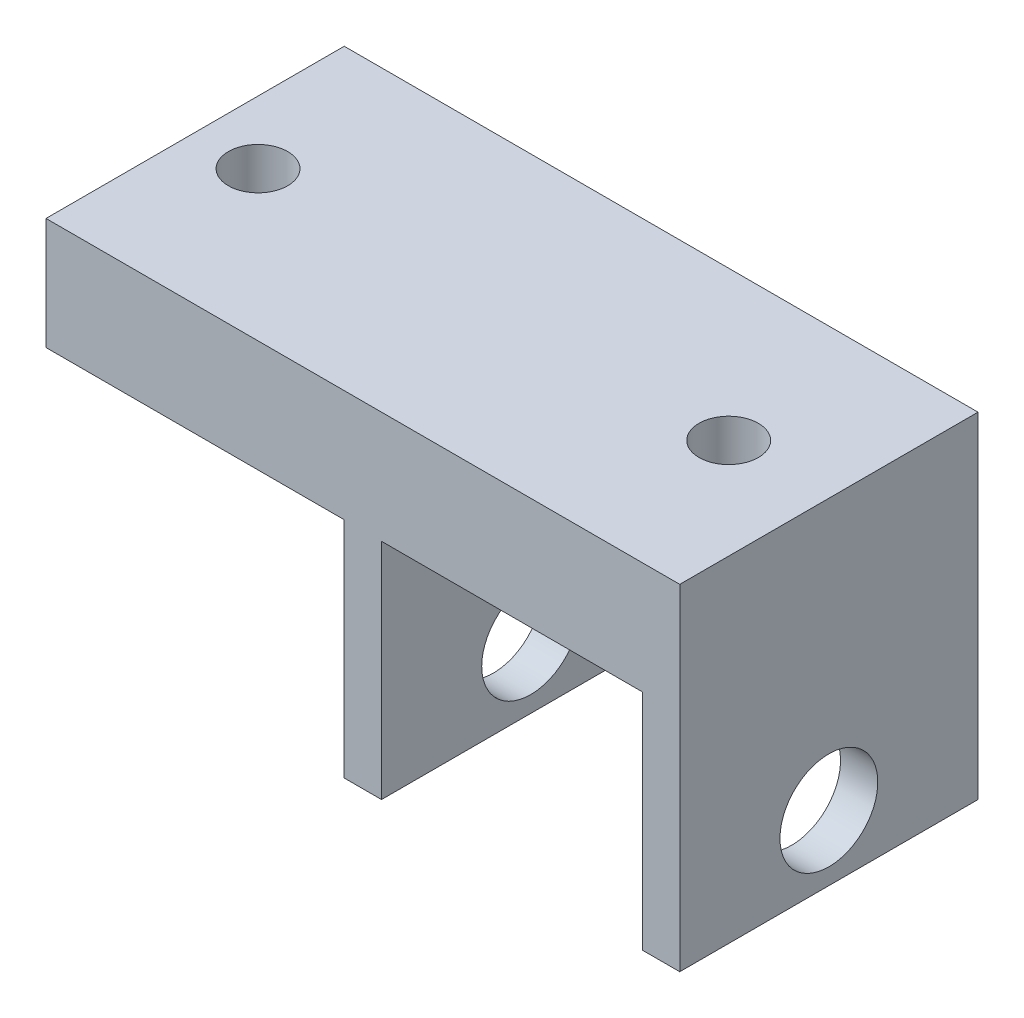
ISO-10303-21;
HEADER;
FILE_DESCRIPTION(('STEP AP214'),'2;1');
FILE_NAME('part.step','',(''),(''),'','','');
FILE_SCHEMA(('AUTOMOTIVE_DESIGN { 1 0 10303 214 1 1 1 1 }'));
ENDSEC;
DATA;
#1=APPLICATION_CONTEXT('core data for automotive mechanical design processes');
#2=APPLICATION_PROTOCOL_DEFINITION('international standard','automotive_design',2000,#1);
#3=PRODUCT_CONTEXT('',#1,'mechanical');
#4=PRODUCT('Part','Part','',(#3));
#5=PRODUCT_RELATED_PRODUCT_CATEGORY('part','',(#4));
#6=PRODUCT_DEFINITION_FORMATION('','',#4);
#7=PRODUCT_DEFINITION_CONTEXT('part definition',#1,'design');
#8=PRODUCT_DEFINITION('design','',#6,#7);
#9=PRODUCT_DEFINITION_SHAPE('','',#8);
#10=(LENGTH_UNIT() NAMED_UNIT(*) SI_UNIT(.MILLI.,.METRE.));
#11=(NAMED_UNIT(*) PLANE_ANGLE_UNIT() SI_UNIT($,.RADIAN.));
#12=(NAMED_UNIT(*) SI_UNIT($,.STERADIAN.) SOLID_ANGLE_UNIT());
#13=UNCERTAINTY_MEASURE_WITH_UNIT(LENGTH_MEASURE(1.E-05),#10,'distance_accuracy_value','');
#14=(GEOMETRIC_REPRESENTATION_CONTEXT(3) GLOBAL_UNCERTAINTY_ASSIGNED_CONTEXT((#13)) GLOBAL_UNIT_ASSIGNED_CONTEXT((#10,
#11,#12)) REPRESENTATION_CONTEXT('',''));
#15=CARTESIAN_POINT('',(0.,0.,0.));
#16=DIRECTION('',(0.,0.,1.));
#17=DIRECTION('',(1.,0.,0.));
#18=AXIS2_PLACEMENT_3D('',#15,#16,#17);
#19=CARTESIAN_POINT('',(-39.6875,19.05,25.4));
#20=DIRECTION('',(1.,0.,0.));
#21=DIRECTION('',(0.,0.,-1.));
#22=AXIS2_PLACEMENT_3D('',#19,#20,#21);
#23=PLANE('',#22);
#24=DIRECTION('',(0.,-1.,0.));
#25=VECTOR('',#24,1.);
#26=CARTESIAN_POINT('',(-39.6875,19.05,0.));
#27=LINE('',#26,#25);
#28=CARTESIAN_POINT('',(-39.6875,19.05,0.));
#29=VERTEX_POINT('',#28);
#30=CARTESIAN_POINT('',(-39.6875,9.525,0.));
#31=VERTEX_POINT('',#30);
#32=EDGE_CURVE('E142',#29,#31,#27,.T.);
#33=ORIENTED_EDGE('',*,*,#32,.T.);
#34=DIRECTION('',(0.,0.,-1.));
#35=VECTOR('',#34,1.);
#36=CARTESIAN_POINT('',(-39.6875,9.525,25.4));
#37=LINE('',#36,#35);
#38=CARTESIAN_POINT('',(-39.6875,9.525,25.4));
#39=VERTEX_POINT('',#38);
#40=EDGE_CURVE('E11',#39,#31,#37,.T.);
#41=ORIENTED_EDGE('',*,*,#40,.F.);
#42=DIRECTION('',(0.,-1.,0.));
#43=VECTOR('',#42,1.);
#44=CARTESIAN_POINT('',(-39.6875,19.05,25.4));
#45=LINE('',#44,#43);
#46=CARTESIAN_POINT('',(-39.6875,19.05,25.4));
#47=VERTEX_POINT('',#46);
#48=EDGE_CURVE('E166',#47,#39,#45,.T.);
#49=ORIENTED_EDGE('',*,*,#48,.F.);
#50=DIRECTION('',(0.,0.,-1.));
#51=VECTOR('',#50,1.);
#52=CARTESIAN_POINT('',(-39.6875,19.05,25.4));
#53=LINE('',#52,#51);
#54=EDGE_CURVE('E49',#47,#29,#53,.T.);
#55=ORIENTED_EDGE('',*,*,#54,.T.);
#56=EDGE_LOOP('',(#33,#41,#49,#55));
#57=FACE_BOUND('',#56,.T.);
#58=ADVANCED_FACE('F32',(#57),#23,.F.);
#59=CARTESIAN_POINT('',(-39.6875,9.525,25.4));
#60=DIRECTION('',(0.,1.,0.));
#61=DIRECTION('',(0.,0.,1.));
#62=AXIS2_PLACEMENT_3D('',#59,#60,#61);
#63=PLANE('',#62);
#64=CARTESIAN_POINT('',(-34.3296875,9.525,12.7));
#65=DIRECTION('',(0.,1.,0.));
#66=DIRECTION('',(0.,0.,1.));
#67=AXIS2_PLACEMENT_3D('',#64,#65,#66);
#68=CIRCLE('',#67,2.52729999999999);
#69=CARTESIAN_POINT('',(-34.3296875,9.525,15.2273));
#70=VERTEX_POINT('',#69);
#71=EDGE_CURVE('E249',#70,#70,#68,.T.);
#72=ORIENTED_EDGE('',*,*,#71,.T.);
#73=EDGE_LOOP('',(#72));
#74=FACE_BOUND('',#73,.T.);
#75=DIRECTION('',(1.,0.,0.));
#76=VECTOR('',#75,1.);
#77=CARTESIAN_POINT('',(-39.6875,9.525,0.));
#78=LINE('',#77,#76);
#79=CARTESIAN_POINT('',(-14.2875,9.525,0.));
#80=VERTEX_POINT('',#79);
#81=EDGE_CURVE('E144',#31,#80,#78,.T.);
#82=ORIENTED_EDGE('',*,*,#81,.T.);
#83=DIRECTION('',(0.,0.,-1.));
#84=VECTOR('',#83,1.);
#85=CARTESIAN_POINT('',(-14.2875,9.525,25.4));
#86=LINE('',#85,#84);
#87=CARTESIAN_POINT('',(-14.2875,9.525,25.4));
#88=VERTEX_POINT('',#87);
#89=EDGE_CURVE('E41',#88,#80,#86,.T.);
#90=ORIENTED_EDGE('',*,*,#89,.F.);
#91=DIRECTION('',(1.,0.,0.));
#92=VECTOR('',#91,1.);
#93=CARTESIAN_POINT('',(-39.6875,9.525,25.4));
#94=LINE('',#93,#92);
#95=EDGE_CURVE('E93',#39,#88,#94,.T.);
#96=ORIENTED_EDGE('',*,*,#95,.F.);
#97=ORIENTED_EDGE('',*,*,#40,.T.);
#98=EDGE_LOOP('',(#82,#90,#96,#97));
#99=FACE_BOUND('',#98,.T.);
#100=ADVANCED_FACE('F226',(#74,#99),#63,.F.);
#101=CARTESIAN_POINT('',(-14.2875,9.525,25.4));
#102=DIRECTION('',(1.,0.,0.));
#103=DIRECTION('',(0.,0.,-1.));
#104=AXIS2_PLACEMENT_3D('',#101,#102,#103);
#105=PLANE('',#104);
#106=CARTESIAN_POINT('',(-14.2875,-3.96875,12.7));
#107=DIRECTION('',(-1.,0.,0.));
#108=DIRECTION('',(0.,0.,1.));
#109=AXIS2_PLACEMENT_3D('',#106,#107,#108);
#110=CIRCLE('',#109,4.1671875);
#111=CARTESIAN_POINT('',(-14.2875,-3.96875,16.8671875));
#112=VERTEX_POINT('',#111);
#113=EDGE_CURVE('E241',#112,#112,#110,.T.);
#114=ORIENTED_EDGE('',*,*,#113,.F.);
#115=EDGE_LOOP('',(#114));
#116=FACE_BOUND('',#115,.T.);
#117=DIRECTION('',(0.,-1.,0.));
#118=VECTOR('',#117,1.);
#119=CARTESIAN_POINT('',(-14.2875,9.525,0.));
#120=LINE('',#119,#118);
#121=CARTESIAN_POINT('',(-14.2875,-9.525,0.));
#122=VERTEX_POINT('',#121);
#123=EDGE_CURVE('E147',#80,#122,#120,.T.);
#124=ORIENTED_EDGE('',*,*,#123,.T.);
#125=DIRECTION('',(0.,0.,-1.));
#126=VECTOR('',#125,1.);
#127=CARTESIAN_POINT('',(-14.2875,-9.525,25.4));
#128=LINE('',#127,#126);
#129=CARTESIAN_POINT('',(-14.2875,-9.525,25.4));
#130=VERTEX_POINT('',#129);
#131=EDGE_CURVE('E177',#130,#122,#128,.T.);
#132=ORIENTED_EDGE('',*,*,#131,.F.);
#133=DIRECTION('',(0.,-1.,0.));
#134=VECTOR('',#133,1.);
#135=CARTESIAN_POINT('',(-14.2875,9.525,25.4));
#136=LINE('',#135,#134);
#137=EDGE_CURVE('E186',#88,#130,#136,.T.);
#138=ORIENTED_EDGE('',*,*,#137,.F.);
#139=ORIENTED_EDGE('',*,*,#89,.T.);
#140=EDGE_LOOP('',(#124,#132,#138,#139));
#141=FACE_BOUND('',#140,.T.);
#142=ADVANCED_FACE('F184',(#116,#141),#105,.F.);
#143=CARTESIAN_POINT('',(-14.2875,-9.525,25.4));
#144=DIRECTION('',(0.,1.,0.));
#145=DIRECTION('',(0.,0.,1.));
#146=AXIS2_PLACEMENT_3D('',#143,#144,#145);
#147=PLANE('',#146);
#148=DIRECTION('',(1.,0.,0.));
#149=VECTOR('',#148,1.);
#150=CARTESIAN_POINT('',(-14.2875,-9.525,0.));
#151=LINE('',#150,#149);
#152=CARTESIAN_POINT('',(-11.1125,-9.525,0.));
#153=VERTEX_POINT('',#152);
#154=EDGE_CURVE('E149',#122,#153,#151,.T.);
#155=ORIENTED_EDGE('',*,*,#154,.T.);
#156=DIRECTION('',(0.,0.,-1.));
#157=VECTOR('',#156,1.);
#158=CARTESIAN_POINT('',(-11.1125,-9.525,25.4));
#159=LINE('',#158,#157);
#160=CARTESIAN_POINT('',(-11.1125,-9.525,25.4));
#161=VERTEX_POINT('',#160);
#162=EDGE_CURVE('E174',#161,#153,#159,.T.);
#163=ORIENTED_EDGE('',*,*,#162,.F.);
#164=DIRECTION('',(1.,0.,0.));
#165=VECTOR('',#164,1.);
#166=CARTESIAN_POINT('',(-14.2875,-9.525,25.4));
#167=LINE('',#166,#165);
#168=EDGE_CURVE('E202',#130,#161,#167,.T.);
#169=ORIENTED_EDGE('',*,*,#168,.F.);
#170=ORIENTED_EDGE('',*,*,#131,.T.);
#171=EDGE_LOOP('',(#155,#163,#169,#170));
#172=FACE_BOUND('',#171,.T.);
#173=ADVANCED_FACE('F193',(#172),#147,.F.);
#174=CARTESIAN_POINT('',(-11.1125,-9.525,25.4));
#175=DIRECTION('',(-1.,0.,0.));
#176=DIRECTION('',(0.,0.,1.));
#177=AXIS2_PLACEMENT_3D('',#174,#175,#176);
#178=PLANE('',#177);
#179=CARTESIAN_POINT('',(-11.1125,-3.96875,12.7));
#180=DIRECTION('',(-1.,0.,0.));
#181=DIRECTION('',(0.,0.,1.));
#182=AXIS2_PLACEMENT_3D('',#179,#180,#181);
#183=CIRCLE('',#182,4.1671875);
#184=CARTESIAN_POINT('',(-11.1125,-3.96875,16.8671875));
#185=VERTEX_POINT('',#184);
#186=EDGE_CURVE('E145',#185,#185,#183,.T.);
#187=ORIENTED_EDGE('',*,*,#186,.T.);
#188=EDGE_LOOP('',(#187));
#189=FACE_BOUND('',#188,.T.);
#190=DIRECTION('',(0.,1.,0.));
#191=VECTOR('',#190,1.);
#192=CARTESIAN_POINT('',(-11.1125,-9.525,0.));
#193=LINE('',#192,#191);
#194=CARTESIAN_POINT('',(-11.1125,9.525,0.));
#195=VERTEX_POINT('',#194);
#196=EDGE_CURVE('E151',#153,#195,#193,.T.);
#197=ORIENTED_EDGE('',*,*,#196,.T.);
#198=DIRECTION('',(0.,0.,-1.));
#199=VECTOR('',#198,1.);
#200=CARTESIAN_POINT('',(-11.1125,9.525,25.4));
#201=LINE('',#200,#199);
#202=CARTESIAN_POINT('',(-11.1125,9.525,25.4));
#203=VERTEX_POINT('',#202);
#204=EDGE_CURVE('E172',#203,#195,#201,.T.);
#205=ORIENTED_EDGE('',*,*,#204,.F.);
#206=DIRECTION('',(0.,1.,0.));
#207=VECTOR('',#206,1.);
#208=CARTESIAN_POINT('',(-11.1125,-9.525,25.4));
#209=LINE('',#208,#207);
#210=EDGE_CURVE('E199',#161,#203,#209,.T.);
#211=ORIENTED_EDGE('',*,*,#210,.F.);
#212=ORIENTED_EDGE('',*,*,#162,.T.);
#213=EDGE_LOOP('',(#197,#205,#211,#212));
#214=FACE_BOUND('',#213,.T.);
#215=ADVANCED_FACE('F197',(#189,#214),#178,.F.);
#216=CARTESIAN_POINT('',(11.1125,9.525,25.4));
#217=DIRECTION('',(0.,-1.,0.));
#218=DIRECTION('',(0.,0.,-1.));
#219=AXIS2_PLACEMENT_3D('',#216,#217,#218);
#220=PLANE('',#219);
#221=CARTESIAN_POINT('',(5.7546875,9.525,12.7));
#222=DIRECTION('',(0.,-1.,0.));
#223=DIRECTION('',(0.,0.,-1.));
#224=AXIS2_PLACEMENT_3D('',#221,#222,#223);
#225=CIRCLE('',#224,2.52729999999999);
#226=CARTESIAN_POINT('',(5.7546875,9.525,10.1727));
#227=VERTEX_POINT('',#226);
#228=EDGE_CURVE('E35',#227,#227,#225,.T.);
#229=ORIENTED_EDGE('',*,*,#228,.F.);
#230=EDGE_LOOP('',(#229));
#231=FACE_BOUND('',#230,.T.);
#232=DIRECTION('',(-1.,0.,0.));
#233=VECTOR('',#232,1.);
#234=CARTESIAN_POINT('',(11.1125,9.525,0.));
#235=LINE('',#234,#233);
#236=CARTESIAN_POINT('',(11.1125,9.525,0.));
#237=VERTEX_POINT('',#236);
#238=EDGE_CURVE('E154',#237,#195,#235,.T.);
#239=ORIENTED_EDGE('',*,*,#238,.F.);
#240=DIRECTION('',(0.,0.,-1.));
#241=VECTOR('',#240,1.);
#242=CARTESIAN_POINT('',(11.1125,9.525,25.4));
#243=LINE('',#242,#241);
#244=CARTESIAN_POINT('',(11.1125,9.525,25.4));
#245=VERTEX_POINT('',#244);
#246=EDGE_CURVE('E170',#245,#237,#243,.T.);
#247=ORIENTED_EDGE('',*,*,#246,.F.);
#248=DIRECTION('',(-1.,0.,0.));
#249=VECTOR('',#248,1.);
#250=CARTESIAN_POINT('',(11.1125,9.525,25.4));
#251=LINE('',#250,#249);
#252=EDGE_CURVE('E201',#245,#203,#251,.T.);
#253=ORIENTED_EDGE('',*,*,#252,.T.);
#254=ORIENTED_EDGE('',*,*,#204,.T.);
#255=EDGE_LOOP('',(#239,#247,#253,#254));
#256=FACE_BOUND('',#255,.T.);
#257=ADVANCED_FACE('F308',(#231,#256),#220,.T.);
#258=CARTESIAN_POINT('',(11.1125,-9.525,25.4));
#259=DIRECTION('',(-1.,0.,0.));
#260=DIRECTION('',(0.,0.,1.));
#261=AXIS2_PLACEMENT_3D('',#258,#259,#260);
#262=PLANE('',#261);
#263=CARTESIAN_POINT('',(11.1125,-3.96875,12.7));
#264=DIRECTION('',(-1.,0.,0.));
#265=DIRECTION('',(0.,0.,1.));
#266=AXIS2_PLACEMENT_3D('',#263,#264,#265);
#267=CIRCLE('',#266,4.1671875);
#268=CARTESIAN_POINT('',(11.1125,-3.96875,16.8671875));
#269=VERTEX_POINT('',#268);
#270=EDGE_CURVE('E237',#269,#269,#267,.T.);
#271=ORIENTED_EDGE('',*,*,#270,.F.);
#272=EDGE_LOOP('',(#271));
#273=FACE_BOUND('',#272,.T.);
#274=DIRECTION('',(0.,1.,0.));
#275=VECTOR('',#274,1.);
#276=CARTESIAN_POINT('',(11.1125,-9.525,0.));
#277=LINE('',#276,#275);
#278=CARTESIAN_POINT('',(11.1125,-9.525,0.));
#279=VERTEX_POINT('',#278);
#280=EDGE_CURVE('E157',#279,#237,#277,.T.);
#281=ORIENTED_EDGE('',*,*,#280,.F.);
#282=DIRECTION('',(0.,0.,-1.));
#283=VECTOR('',#282,1.);
#284=CARTESIAN_POINT('',(11.1125,-9.525,25.4));
#285=LINE('',#284,#283);
#286=CARTESIAN_POINT('',(11.1125,-9.525,25.4));
#287=VERTEX_POINT('',#286);
#288=EDGE_CURVE('E134',#287,#279,#285,.T.);
#289=ORIENTED_EDGE('',*,*,#288,.F.);
#290=DIRECTION('',(0.,1.,0.));
#291=VECTOR('',#290,1.);
#292=CARTESIAN_POINT('',(11.1125,-9.525,25.4));
#293=LINE('',#292,#291);
#294=EDGE_CURVE('E124',#287,#245,#293,.T.);
#295=ORIENTED_EDGE('',*,*,#294,.T.);
#296=ORIENTED_EDGE('',*,*,#246,.T.);
#297=EDGE_LOOP('',(#281,#289,#295,#296));
#298=FACE_BOUND('',#297,.T.);
#299=ADVANCED_FACE('F209',(#273,#298),#262,.T.);
#300=CARTESIAN_POINT('',(11.1125,-9.525,25.4));
#301=DIRECTION('',(0.,1.,0.));
#302=DIRECTION('',(0.,0.,1.));
#303=AXIS2_PLACEMENT_3D('',#300,#301,#302);
#304=PLANE('',#303);
#305=DIRECTION('',(1.,0.,0.));
#306=VECTOR('',#305,1.);
#307=CARTESIAN_POINT('',(11.1125,-9.525,0.));
#308=LINE('',#307,#306);
#309=CARTESIAN_POINT('',(14.2875,-9.525,0.));
#310=VERTEX_POINT('',#309);
#311=EDGE_CURVE('E131',#279,#310,#308,.T.);
#312=ORIENTED_EDGE('',*,*,#311,.T.);
#313=DIRECTION('',(0.,0.,-1.));
#314=VECTOR('',#313,1.);
#315=CARTESIAN_POINT('',(14.2875,-9.525,25.4));
#316=LINE('',#315,#314);
#317=CARTESIAN_POINT('',(14.2875,-9.525,25.4));
#318=VERTEX_POINT('',#317);
#319=EDGE_CURVE('E128',#318,#310,#316,.T.);
#320=ORIENTED_EDGE('',*,*,#319,.F.);
#321=DIRECTION('',(1.,0.,0.));
#322=VECTOR('',#321,1.);
#323=CARTESIAN_POINT('',(11.1125,-9.525,25.4));
#324=LINE('',#323,#322);
#325=EDGE_CURVE('E116',#287,#318,#324,.T.);
#326=ORIENTED_EDGE('',*,*,#325,.F.);
#327=ORIENTED_EDGE('',*,*,#288,.T.);
#328=EDGE_LOOP('',(#312,#320,#326,#327));
#329=FACE_BOUND('',#328,.T.);
#330=ADVANCED_FACE('F129',(#329),#304,.F.);
#331=CARTESIAN_POINT('',(14.2875,19.05,25.4));
#332=DIRECTION('',(1.,0.,0.));
#333=DIRECTION('',(0.,0.,-1.));
#334=AXIS2_PLACEMENT_3D('',#331,#332,#333);
#335=PLANE('',#334);
#336=CARTESIAN_POINT('',(14.2875,-3.96875,12.7));
#337=DIRECTION('',(-1.,0.,0.));
#338=DIRECTION('',(0.,0.,1.));
#339=AXIS2_PLACEMENT_3D('',#336,#337,#338);
#340=CIRCLE('',#339,4.1671875);
#341=CARTESIAN_POINT('',(14.2875,-3.96875,16.8671875));
#342=VERTEX_POINT('',#341);
#343=EDGE_CURVE('E240',#342,#342,#340,.T.);
#344=ORIENTED_EDGE('',*,*,#343,.T.);
#345=EDGE_LOOP('',(#344));
#346=FACE_BOUND('',#345,.T.);
#347=DIRECTION('',(0.,-1.,0.));
#348=VECTOR('',#347,1.);
#349=CARTESIAN_POINT('',(14.2875,19.05,0.));
#350=LINE('',#349,#348);
#351=CARTESIAN_POINT('',(14.2875,19.05,0.));
#352=VERTEX_POINT('',#351);
#353=EDGE_CURVE('E161',#352,#310,#350,.T.);
#354=ORIENTED_EDGE('',*,*,#353,.F.);
#355=DIRECTION('',(0.,0.,-1.));
#356=VECTOR('',#355,1.);
#357=CARTESIAN_POINT('',(14.2875,19.05,25.4));
#358=LINE('',#357,#356);
#359=CARTESIAN_POINT('',(14.2875,19.05,25.4));
#360=VERTEX_POINT('',#359);
#361=EDGE_CURVE('E81',#360,#352,#358,.T.);
#362=ORIENTED_EDGE('',*,*,#361,.F.);
#363=DIRECTION('',(0.,-1.,0.));
#364=VECTOR('',#363,1.);
#365=CARTESIAN_POINT('',(14.2875,19.05,25.4));
#366=LINE('',#365,#364);
#367=EDGE_CURVE('E121',#360,#318,#366,.T.);
#368=ORIENTED_EDGE('',*,*,#367,.T.);
#369=ORIENTED_EDGE('',*,*,#319,.T.);
#370=EDGE_LOOP('',(#354,#362,#368,#369));
#371=FACE_BOUND('',#370,.T.);
#372=ADVANCED_FACE('F136',(#346,#371),#335,.T.);
#373=CARTESIAN_POINT('',(-39.6875,19.05,25.4));
#374=DIRECTION('',(0.,1.,0.));
#375=DIRECTION('',(0.,0.,1.));
#376=AXIS2_PLACEMENT_3D('',#373,#374,#375);
#377=PLANE('',#376);
#378=CARTESIAN_POINT('',(-34.3296875,19.05,12.7));
#379=DIRECTION('',(0.,1.,0.));
#380=DIRECTION('',(0.,0.,1.));
#381=AXIS2_PLACEMENT_3D('',#378,#379,#380);
#382=CIRCLE('',#381,2.52729999999999);
#383=CARTESIAN_POINT('',(-34.3296875,19.05,15.2273));
#384=VERTEX_POINT('',#383);
#385=EDGE_CURVE('E252',#384,#384,#382,.T.);
#386=ORIENTED_EDGE('',*,*,#385,.F.);
#387=EDGE_LOOP('',(#386));
#388=FACE_BOUND('',#387,.T.);
#389=CARTESIAN_POINT('',(5.7546875,19.05,12.7));
#390=DIRECTION('',(0.,1.,0.));
#391=DIRECTION('',(0.,0.,1.));
#392=AXIS2_PLACEMENT_3D('',#389,#390,#391);
#393=CIRCLE('',#392,2.52729999999999);
#394=CARTESIAN_POINT('',(5.7546875,19.05,15.2273));
#395=VERTEX_POINT('',#394);
#396=EDGE_CURVE('E246',#395,#395,#393,.T.);
#397=ORIENTED_EDGE('',*,*,#396,.F.);
#398=EDGE_LOOP('',(#397));
#399=FACE_BOUND('',#398,.T.);
#400=DIRECTION('',(1.,0.,0.));
#401=VECTOR('',#400,1.);
#402=CARTESIAN_POINT('',(-39.6875,19.05,0.));
#403=LINE('',#402,#401);
#404=EDGE_CURVE('E163',#29,#352,#403,.T.);
#405=ORIENTED_EDGE('',*,*,#404,.F.);
#406=ORIENTED_EDGE('',*,*,#54,.F.);
#407=DIRECTION('',(1.,0.,0.));
#408=VECTOR('',#407,1.);
#409=CARTESIAN_POINT('',(-39.6875,19.05,25.4));
#410=LINE('',#409,#408);
#411=EDGE_CURVE('E137',#47,#360,#410,.T.);
#412=ORIENTED_EDGE('',*,*,#411,.T.);
#413=ORIENTED_EDGE('',*,*,#361,.T.);
#414=EDGE_LOOP('',(#405,#406,#412,#413));
#415=FACE_BOUND('',#414,.T.);
#416=ADVANCED_FACE('F211',(#388,#399,#415),#377,.T.);
#417=CARTESIAN_POINT('',(0.,0.,25.4));
#418=DIRECTION('',(0.,0.,1.));
#419=DIRECTION('',(1.,0.,0.));
#420=AXIS2_PLACEMENT_3D('',#417,#418,#419);
#421=PLANE('',#420);
#422=ORIENTED_EDGE('',*,*,#48,.T.);
#423=ORIENTED_EDGE('',*,*,#95,.T.);
#424=ORIENTED_EDGE('',*,*,#137,.T.);
#425=ORIENTED_EDGE('',*,*,#168,.T.);
#426=ORIENTED_EDGE('',*,*,#210,.T.);
#427=ORIENTED_EDGE('',*,*,#252,.F.);
#428=ORIENTED_EDGE('',*,*,#294,.F.);
#429=ORIENTED_EDGE('',*,*,#325,.T.);
#430=ORIENTED_EDGE('',*,*,#367,.F.);
#431=ORIENTED_EDGE('',*,*,#411,.F.);
#432=EDGE_LOOP('',(#422,#423,#424,#425,#426,#427,#428,#429,#430,#431));
#433=FACE_BOUND('',#432,.T.);
#434=ADVANCED_FACE('F118',(#433),#421,.T.);
#435=CARTESIAN_POINT('',(0.,0.,0.));
#436=DIRECTION('',(0.,0.,1.));
#437=DIRECTION('',(1.,0.,0.));
#438=AXIS2_PLACEMENT_3D('',#435,#436,#437);
#439=PLANE('',#438);
#440=ORIENTED_EDGE('',*,*,#32,.F.);
#441=ORIENTED_EDGE('',*,*,#404,.T.);
#442=ORIENTED_EDGE('',*,*,#353,.T.);
#443=ORIENTED_EDGE('',*,*,#311,.F.);
#444=ORIENTED_EDGE('',*,*,#280,.T.);
#445=ORIENTED_EDGE('',*,*,#238,.T.);
#446=ORIENTED_EDGE('',*,*,#196,.F.);
#447=ORIENTED_EDGE('',*,*,#154,.F.);
#448=ORIENTED_EDGE('',*,*,#123,.F.);
#449=ORIENTED_EDGE('',*,*,#81,.F.);
#450=EDGE_LOOP('',(#440,#441,#442,#443,#444,#445,#446,#447,#448,#449));
#451=FACE_BOUND('',#450,.T.);
#452=ADVANCED_FACE('F189',(#451),#439,.F.);
#453=CARTESIAN_POINT('',(14.2875,-3.96875,12.7));
#454=DIRECTION('',(-1.,0.,0.));
#455=DIRECTION('',(0.,0.,1.));
#456=AXIS2_PLACEMENT_3D('',#453,#454,#455);
#457=CYLINDRICAL_SURFACE('',#456,4.1671875);
#458=ORIENTED_EDGE('',*,*,#270,.T.);
#459=EDGE_LOOP('',(#458));
#460=FACE_BOUND('',#459,.T.);
#461=ORIENTED_EDGE('',*,*,#343,.F.);
#462=EDGE_LOOP('',(#461));
#463=FACE_BOUND('',#462,.T.);
#464=ADVANCED_FACE('F268',(#460,#463),#457,.F.);
#465=ORIENTED_EDGE('',*,*,#113,.T.);
#466=EDGE_LOOP('',(#465));
#467=FACE_BOUND('',#466,.T.);
#468=ORIENTED_EDGE('',*,*,#186,.F.);
#469=EDGE_LOOP('',(#468));
#470=FACE_BOUND('',#469,.T.);
#471=ADVANCED_FACE('F264',(#467,#470),#457,.F.);
#472=CARTESIAN_POINT('',(5.7546875,19.05,12.7));
#473=DIRECTION('',(0.,1.,0.));
#474=DIRECTION('',(0.,0.,1.));
#475=AXIS2_PLACEMENT_3D('',#472,#473,#474);
#476=CYLINDRICAL_SURFACE('',#475,2.52729999999999);
#477=ORIENTED_EDGE('',*,*,#228,.T.);
#478=EDGE_LOOP('',(#477));
#479=FACE_BOUND('',#478,.T.);
#480=ORIENTED_EDGE('',*,*,#396,.T.);
#481=EDGE_LOOP('',(#480));
#482=FACE_BOUND('',#481,.T.);
#483=ADVANCED_FACE('F258',(#479,#482),#476,.F.);
#484=CARTESIAN_POINT('',(-34.3296875,19.05,12.7));
#485=DIRECTION('',(0.,1.,0.));
#486=DIRECTION('',(0.,0.,1.));
#487=AXIS2_PLACEMENT_3D('',#484,#485,#486);
#488=CYLINDRICAL_SURFACE('',#487,2.52729999999999);
#489=ORIENTED_EDGE('',*,*,#385,.T.);
#490=EDGE_LOOP('',(#489));
#491=FACE_BOUND('',#490,.T.);
#492=ORIENTED_EDGE('',*,*,#71,.F.);
#493=EDGE_LOOP('',(#492));
#494=FACE_BOUND('',#493,.T.);
#495=ADVANCED_FACE('F255',(#491,#494),#488,.F.);
#496=CLOSED_SHELL('',(#58,#100,#142,#173,#215,#257,#299,#330,#372,#416,#434,#452,#464,#471,#483,#495));
#497=MANIFOLD_SOLID_BREP('B2',#496);
#498=ADVANCED_BREP_SHAPE_REPRESENTATION('',(#18,#497),#14);
#499=SHAPE_DEFINITION_REPRESENTATION(#9,#498);
ENDSEC;
END-ISO-10303-21;
